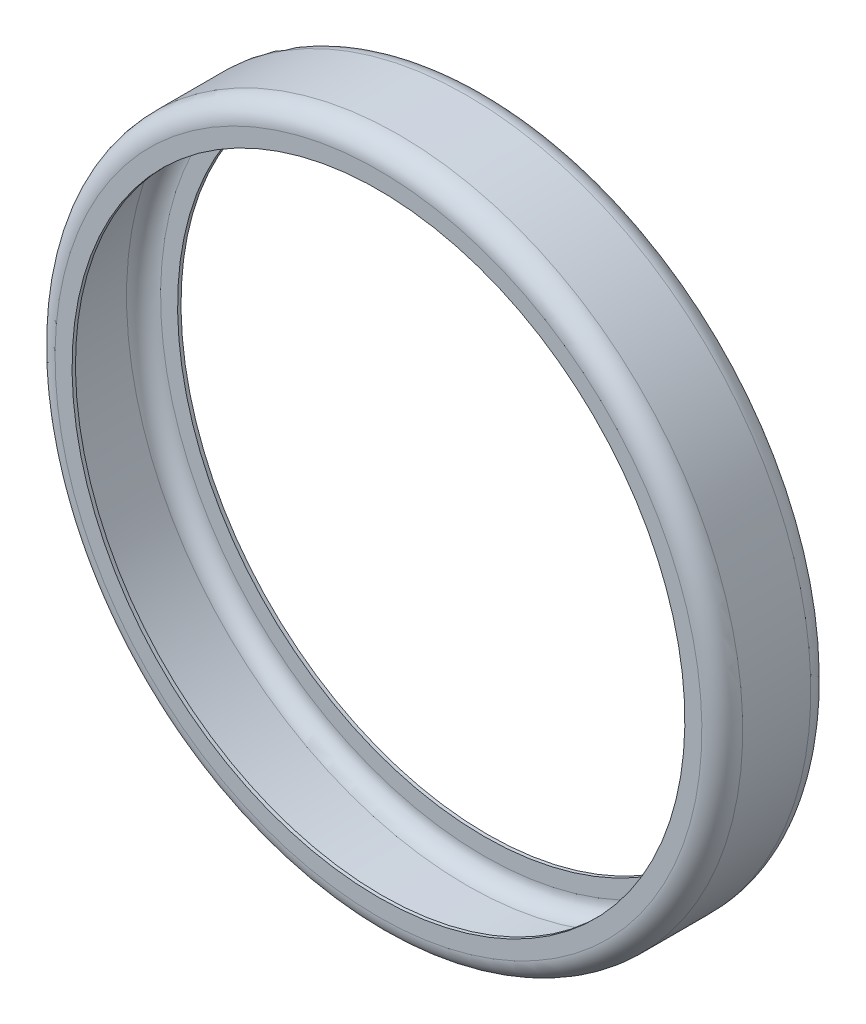
ISO-10303-21;
HEADER;
FILE_DESCRIPTION(('STEP AP214'),'2;1');
FILE_NAME('part.step','',(''),(''),'','','');
FILE_SCHEMA(('AUTOMOTIVE_DESIGN { 1 0 10303 214 1 1 1 1 }'));
ENDSEC;
DATA;
#1=APPLICATION_CONTEXT('core data for automotive mechanical design processes');
#2=APPLICATION_PROTOCOL_DEFINITION('international standard','automotive_design',2000,#1);
#3=PRODUCT_CONTEXT('',#1,'mechanical');
#4=PRODUCT('Part','Part','',(#3));
#5=PRODUCT_RELATED_PRODUCT_CATEGORY('part','',(#4));
#6=PRODUCT_DEFINITION_FORMATION('','',#4);
#7=PRODUCT_DEFINITION_CONTEXT('part definition',#1,'design');
#8=PRODUCT_DEFINITION('design','',#6,#7);
#9=PRODUCT_DEFINITION_SHAPE('','',#8);
#10=(LENGTH_UNIT() NAMED_UNIT(*) SI_UNIT(.MILLI.,.METRE.));
#11=(NAMED_UNIT(*) PLANE_ANGLE_UNIT() SI_UNIT($,.RADIAN.));
#12=(NAMED_UNIT(*) SI_UNIT($,.STERADIAN.) SOLID_ANGLE_UNIT());
#13=UNCERTAINTY_MEASURE_WITH_UNIT(LENGTH_MEASURE(1.E-05),#10,'distance_accuracy_value','');
#14=(GEOMETRIC_REPRESENTATION_CONTEXT(3) GLOBAL_UNCERTAINTY_ASSIGNED_CONTEXT((#13)) GLOBAL_UNIT_ASSIGNED_CONTEXT((#10,
#11,#12)) REPRESENTATION_CONTEXT('',''));
#15=CARTESIAN_POINT('',(0.,0.,0.));
#16=DIRECTION('',(0.,0.,1.));
#17=DIRECTION('',(1.,0.,0.));
#18=AXIS2_PLACEMENT_3D('',#15,#16,#17);
#19=CARTESIAN_POINT('',(-11.7,-6.2,-0.5));
#20=DIRECTION('',(0.,0.,1.));
#21=DIRECTION('',(0.,-1.,0.));
#22=AXIS2_PLACEMENT_3D('',#19,#20,#21);
#23=CYLINDRICAL_SURFACE('',#22,10.);
#24=CARTESIAN_POINT('',(-11.7,-6.2,-3.));
#25=DIRECTION('',(0.,0.,1.));
#26=DIRECTION('',(0.,-1.,0.));
#27=AXIS2_PLACEMENT_3D('',#24,#25,#26);
#28=CIRCLE('',#27,10.);
#29=CARTESIAN_POINT('',(-11.7,-16.2,-3.));
#30=VERTEX_POINT('',#29);
#31=EDGE_CURVE('E120',#30,#30,#28,.F.);
#32=ORIENTED_EDGE('',*,*,#31,.T.);
#33=EDGE_LOOP('',(#32));
#34=FACE_BOUND('',#33,.T.);
#35=CARTESIAN_POINT('',(-11.7,-6.2,-1.));
#36=DIRECTION('',(0.,0.,1.));
#37=DIRECTION('',(0.,-1.,0.));
#38=AXIS2_PLACEMENT_3D('',#35,#36,#37);
#39=CIRCLE('',#38,10.);
#40=CARTESIAN_POINT('',(-11.7,-16.2,-0.999999999999998));
#41=VERTEX_POINT('',#40);
#42=EDGE_CURVE('E140',#41,#41,#39,.T.);
#43=ORIENTED_EDGE('',*,*,#42,.T.);
#44=EDGE_LOOP('',(#43));
#45=FACE_BOUND('',#44,.T.);
#46=ADVANCED_FACE('F15',(#34,#45),#23,.F.);
#47=CARTESIAN_POINT('',(-11.7,-6.2,-1.));
#48=DIRECTION('',(0.,0.,1.));
#49=DIRECTION('',(0.,-1.,0.));
#50=AXIS2_PLACEMENT_3D('',#47,#48,#49);
#51=TOROIDAL_SURFACE('',#50,9.5,0.5);
#52=ORIENTED_EDGE('',*,*,#42,.F.);
#53=EDGE_LOOP('',(#52));
#54=FACE_BOUND('',#53,.T.);
#55=CARTESIAN_POINT('',(-11.7,-6.2,-0.5));
#56=DIRECTION('',(0.,0.,1.));
#57=DIRECTION('',(0.,-1.,0.));
#58=AXIS2_PLACEMENT_3D('',#55,#56,#57);
#59=CIRCLE('',#58,9.5);
#60=CARTESIAN_POINT('',(-11.7,-15.7,-0.499999999999998));
#61=VERTEX_POINT('',#60);
#62=EDGE_CURVE('E109',#61,#61,#59,.T.);
#63=ORIENTED_EDGE('',*,*,#62,.T.);
#64=EDGE_LOOP('',(#63));
#65=FACE_BOUND('',#64,.T.);
#66=ADVANCED_FACE('F125',(#54,#65),#51,.F.);
#67=CARTESIAN_POINT('',(-11.7,-6.2,-3.));
#68=DIRECTION('',(0.,0.,1.));
#69=DIRECTION('',(0.,-1.,0.));
#70=AXIS2_PLACEMENT_3D('',#67,#68,#69);
#71=TOROIDAL_SURFACE('',#70,9.5,0.5);
#72=CARTESIAN_POINT('',(-11.7,-6.2,-3.5));
#73=DIRECTION('',(0.,0.,-1.));
#74=DIRECTION('',(0.,-1.,0.));
#75=AXIS2_PLACEMENT_3D('',#72,#73,#74);
#76=CIRCLE('',#75,9.5);
#77=CARTESIAN_POINT('',(-11.7,-15.7,-3.5));
#78=VERTEX_POINT('',#77);
#79=EDGE_CURVE('E163',#78,#78,#76,.T.);
#80=ORIENTED_EDGE('',*,*,#79,.T.);
#81=EDGE_LOOP('',(#80));
#82=FACE_BOUND('',#81,.T.);
#83=ORIENTED_EDGE('',*,*,#31,.F.);
#84=EDGE_LOOP('',(#83));
#85=FACE_BOUND('',#84,.T.);
#86=ADVANCED_FACE('F122',(#82,#85),#71,.F.);
#87=CARTESIAN_POINT('',(-11.7,-15.2,-0.5));
#88=DIRECTION('',(0.,0.,1.));
#89=DIRECTION('',(0.,-1.,0.));
#90=AXIS2_PLACEMENT_3D('',#87,#88,#89);
#91=PLANE('',#90);
#92=CARTESIAN_POINT('',(-11.7,-6.2,-0.500000000000002));
#93=DIRECTION('',(0.,0.,1.));
#94=DIRECTION('',(0.,-1.,0.));
#95=AXIS2_PLACEMENT_3D('',#92,#93,#94);
#96=CIRCLE('',#95,9.);
#97=CARTESIAN_POINT('',(-11.7,-15.2,-0.5));
#98=VERTEX_POINT('',#97);
#99=EDGE_CURVE('E18',#98,#98,#96,.T.);
#100=ORIENTED_EDGE('',*,*,#99,.T.);
#101=EDGE_LOOP('',(#100));
#102=FACE_BOUND('',#101,.T.);
#103=ORIENTED_EDGE('',*,*,#62,.F.);
#104=EDGE_LOOP('',(#103));
#105=FACE_BOUND('',#104,.T.);
#106=ADVANCED_FACE('F90',(#102,#105),#91,.F.);
#107=CARTESIAN_POINT('',(-11.7,-16.2,-3.5));
#108=DIRECTION('',(0.,0.,-1.));
#109=DIRECTION('',(0.,1.,0.));
#110=AXIS2_PLACEMENT_3D('',#107,#108,#109);
#111=PLANE('',#110);
#112=ORIENTED_EDGE('',*,*,#79,.F.);
#113=EDGE_LOOP('',(#112));
#114=FACE_BOUND('',#113,.T.);
#115=CARTESIAN_POINT('',(-11.7,-6.2,-3.5));
#116=DIRECTION('',(0.,0.,1.));
#117=DIRECTION('',(0.,-1.,0.));
#118=AXIS2_PLACEMENT_3D('',#115,#116,#117);
#119=CIRCLE('',#118,9.);
#120=CARTESIAN_POINT('',(-11.7,-15.2,-3.5));
#121=VERTEX_POINT('',#120);
#122=EDGE_CURVE('E158',#121,#121,#119,.F.);
#123=ORIENTED_EDGE('',*,*,#122,.T.);
#124=EDGE_LOOP('',(#123));
#125=FACE_BOUND('',#124,.T.);
#126=ADVANCED_FACE('F85',(#114,#125),#111,.F.);
#127=CARTESIAN_POINT('',(-11.7,-6.2,-0.5));
#128=DIRECTION('',(0.,0.,1.));
#129=DIRECTION('',(0.,-1.,0.));
#130=AXIS2_PLACEMENT_3D('',#127,#128,#129);
#131=CYLINDRICAL_SURFACE('',#130,9.);
#132=ORIENTED_EDGE('',*,*,#99,.F.);
#133=EDGE_LOOP('',(#132));
#134=FACE_BOUND('',#133,.T.);
#135=CARTESIAN_POINT('',(-11.7,-6.2,-0.400000000000002));
#136=DIRECTION('',(0.,0.,1.));
#137=DIRECTION('',(0.,-1.,0.));
#138=AXIS2_PLACEMENT_3D('',#135,#136,#137);
#139=CIRCLE('',#138,9.);
#140=CARTESIAN_POINT('',(-11.7,-15.2,-0.4));
#141=VERTEX_POINT('',#140);
#142=EDGE_CURVE('E156',#141,#141,#139,.T.);
#143=ORIENTED_EDGE('',*,*,#142,.T.);
#144=EDGE_LOOP('',(#143));
#145=FACE_BOUND('',#144,.T.);
#146=ADVANCED_FACE('F81',(#134,#145),#131,.F.);
#147=CARTESIAN_POINT('',(-11.7,-6.2,-0.5));
#148=DIRECTION('',(0.,0.,1.));
#149=DIRECTION('',(0.,-1.,0.));
#150=AXIS2_PLACEMENT_3D('',#147,#148,#149);
#151=CYLINDRICAL_SURFACE('',#150,9.);
#152=CARTESIAN_POINT('',(-11.7,-6.2,-3.6));
#153=DIRECTION('',(0.,0.,1.));
#154=DIRECTION('',(0.,-1.,0.));
#155=AXIS2_PLACEMENT_3D('',#152,#153,#154);
#156=CIRCLE('',#155,9.);
#157=CARTESIAN_POINT('',(-11.7,-15.2,-3.6));
#158=VERTEX_POINT('',#157);
#159=EDGE_CURVE('E148',#158,#158,#156,.F.);
#160=ORIENTED_EDGE('',*,*,#159,.T.);
#161=EDGE_LOOP('',(#160));
#162=FACE_BOUND('',#161,.T.);
#163=ORIENTED_EDGE('',*,*,#122,.F.);
#164=EDGE_LOOP('',(#163));
#165=FACE_BOUND('',#164,.T.);
#166=ADVANCED_FACE('F77',(#162,#165),#151,.F.);
#167=CARTESIAN_POINT('',(-11.7,-15.2,-0.4));
#168=DIRECTION('',(0.,0.,-1.));
#169=DIRECTION('',(0.,1.,0.));
#170=AXIS2_PLACEMENT_3D('',#167,#168,#169);
#171=PLANE('',#170);
#172=CARTESIAN_POINT('',(-11.7,-6.2,-0.4));
#173=DIRECTION('',(0.,0.,-1.));
#174=DIRECTION('',(0.,-1.,0.));
#175=AXIS2_PLACEMENT_3D('',#172,#173,#174);
#176=CIRCLE('',#175,9.5);
#177=CARTESIAN_POINT('',(-11.7,-15.7,-0.399999999999998));
#178=VERTEX_POINT('',#177);
#179=EDGE_CURVE('E61',#178,#178,#176,.T.);
#180=ORIENTED_EDGE('',*,*,#179,.F.);
#181=EDGE_LOOP('',(#180));
#182=FACE_BOUND('',#181,.T.);
#183=ORIENTED_EDGE('',*,*,#142,.F.);
#184=EDGE_LOOP('',(#183));
#185=FACE_BOUND('',#184,.T.);
#186=ADVANCED_FACE('F67',(#182,#185),#171,.F.);
#187=CARTESIAN_POINT('',(-11.7,-16.2,-3.6));
#188=DIRECTION('',(0.,0.,1.));
#189=DIRECTION('',(0.,-1.,0.));
#190=AXIS2_PLACEMENT_3D('',#187,#188,#189);
#191=PLANE('',#190);
#192=ORIENTED_EDGE('',*,*,#159,.F.);
#193=EDGE_LOOP('',(#192));
#194=FACE_BOUND('',#193,.T.);
#195=CARTESIAN_POINT('',(-11.7,-6.2,-3.6));
#196=DIRECTION('',(0.,0.,1.));
#197=DIRECTION('',(0.,-1.,0.));
#198=AXIS2_PLACEMENT_3D('',#195,#196,#197);
#199=CIRCLE('',#198,9.5);
#200=CARTESIAN_POINT('',(-11.7,-15.7,-3.6));
#201=VERTEX_POINT('',#200);
#202=EDGE_CURVE('E27',#201,#201,#199,.T.);
#203=ORIENTED_EDGE('',*,*,#202,.F.);
#204=EDGE_LOOP('',(#203));
#205=FACE_BOUND('',#204,.T.);
#206=ADVANCED_FACE('F76',(#194,#205),#191,.F.);
#207=CARTESIAN_POINT('',(-11.7,-6.2,-1.));
#208=DIRECTION('',(0.,0.,1.));
#209=DIRECTION('',(0.,-1.,0.));
#210=AXIS2_PLACEMENT_3D('',#207,#208,#209);
#211=TOROIDAL_SURFACE('',#210,9.5,0.6);
#212=ORIENTED_EDGE('',*,*,#179,.T.);
#213=EDGE_LOOP('',(#212));
#214=FACE_BOUND('',#213,.T.);
#215=CARTESIAN_POINT('',(-11.7,-6.2,-1.));
#216=DIRECTION('',(0.,0.,1.));
#217=DIRECTION('',(0.,-1.,0.));
#218=AXIS2_PLACEMENT_3D('',#215,#216,#217);
#219=CIRCLE('',#218,10.1);
#220=CARTESIAN_POINT('',(-11.7,-16.3,-1.));
#221=VERTEX_POINT('',#220);
#222=EDGE_CURVE('E22',#221,#221,#219,.F.);
#223=ORIENTED_EDGE('',*,*,#222,.F.);
#224=EDGE_LOOP('',(#223));
#225=FACE_BOUND('',#224,.T.);
#226=ADVANCED_FACE('F41',(#214,#225),#211,.T.);
#227=CARTESIAN_POINT('',(-11.7,-6.2,-3.));
#228=DIRECTION('',(0.,0.,1.));
#229=DIRECTION('',(0.,-1.,0.));
#230=AXIS2_PLACEMENT_3D('',#227,#228,#229);
#231=TOROIDAL_SURFACE('',#230,9.5,0.6);
#232=CARTESIAN_POINT('',(-11.7,-6.2,-3.));
#233=DIRECTION('',(0.,0.,1.));
#234=DIRECTION('',(0.,-1.,0.));
#235=AXIS2_PLACEMENT_3D('',#232,#233,#234);
#236=CIRCLE('',#235,10.1);
#237=CARTESIAN_POINT('',(-11.7,-16.3,-3.));
#238=VERTEX_POINT('',#237);
#239=EDGE_CURVE('E10',#238,#238,#236,.T.);
#240=ORIENTED_EDGE('',*,*,#239,.F.);
#241=EDGE_LOOP('',(#240));
#242=FACE_BOUND('',#241,.T.);
#243=ORIENTED_EDGE('',*,*,#202,.T.);
#244=EDGE_LOOP('',(#243));
#245=FACE_BOUND('',#244,.T.);
#246=ADVANCED_FACE('F35',(#242,#245),#231,.T.);
#247=CARTESIAN_POINT('',(-11.7,-6.2,-0.5));
#248=DIRECTION('',(0.,0.,1.));
#249=DIRECTION('',(0.,-1.,0.));
#250=AXIS2_PLACEMENT_3D('',#247,#248,#249);
#251=CYLINDRICAL_SURFACE('',#250,10.1);
#252=ORIENTED_EDGE('',*,*,#222,.T.);
#253=EDGE_LOOP('',(#252));
#254=FACE_BOUND('',#253,.T.);
#255=ORIENTED_EDGE('',*,*,#239,.T.);
#256=EDGE_LOOP('',(#255));
#257=FACE_BOUND('',#256,.T.);
#258=ADVANCED_FACE('F40',(#254,#257),#251,.T.);
#259=CLOSED_SHELL('',(#46,#66,#86,#106,#126,#146,#166,#186,#206,#226,#246,#258));
#260=MANIFOLD_SOLID_BREP('B1',#259);
#261=ADVANCED_BREP_SHAPE_REPRESENTATION('',(#18,#260),#14);
#262=SHAPE_DEFINITION_REPRESENTATION(#9,#261);
ENDSEC;
END-ISO-10303-21;
